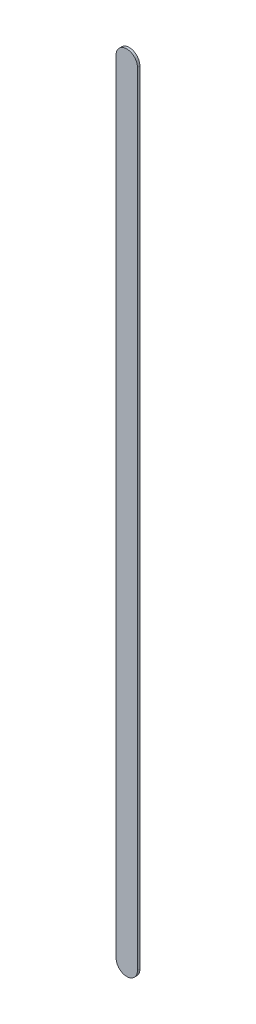
ISO-10303-21;
HEADER;
FILE_DESCRIPTION(('STEP AP214'),'2;1');
FILE_NAME('part.step','',(''),(''),'','','');
FILE_SCHEMA(('AUTOMOTIVE_DESIGN { 1 0 10303 214 1 1 1 1 }'));
ENDSEC;
DATA;
#1=APPLICATION_CONTEXT('core data for automotive mechanical design processes');
#2=APPLICATION_PROTOCOL_DEFINITION('international standard','automotive_design',2000,#1);
#3=PRODUCT_CONTEXT('',#1,'mechanical');
#4=PRODUCT('Part','Part','',(#3));
#5=PRODUCT_RELATED_PRODUCT_CATEGORY('part','',(#4));
#6=PRODUCT_DEFINITION_FORMATION('','',#4);
#7=PRODUCT_DEFINITION_CONTEXT('part definition',#1,'design');
#8=PRODUCT_DEFINITION('design','',#6,#7);
#9=PRODUCT_DEFINITION_SHAPE('','',#8);
#10=(LENGTH_UNIT() NAMED_UNIT(*) SI_UNIT(.MILLI.,.METRE.));
#11=(NAMED_UNIT(*) PLANE_ANGLE_UNIT() SI_UNIT($,.RADIAN.));
#12=(NAMED_UNIT(*) SI_UNIT($,.STERADIAN.) SOLID_ANGLE_UNIT());
#13=UNCERTAINTY_MEASURE_WITH_UNIT(LENGTH_MEASURE(1.E-05),#10,'distance_accuracy_value','');
#14=(GEOMETRIC_REPRESENTATION_CONTEXT(3) GLOBAL_UNCERTAINTY_ASSIGNED_CONTEXT((#13)) GLOBAL_UNIT_ASSIGNED_CONTEXT((#10,
#11,#12)) REPRESENTATION_CONTEXT('',''));
#15=CARTESIAN_POINT('',(0.,0.,0.));
#16=DIRECTION('',(0.,0.,1.));
#17=DIRECTION('',(1.,0.,0.));
#18=AXIS2_PLACEMENT_3D('',#15,#16,#17);
#19=CARTESIAN_POINT('',(136.04,-111.04,0.));
#20=DIRECTION('',(0.,0.,1.));
#21=DIRECTION('',(1.,0.,0.));
#22=AXIS2_PLACEMENT_3D('',#19,#20,#21);
#23=PLANE('',#22);
#24=DIRECTION('',(0.,-1.,0.));
#25=VECTOR('',#24,1.);
#26=CARTESIAN_POINT('',(136.04,-111.04,0.));
#27=LINE('',#26,#25);
#28=CARTESIAN_POINT('',(136.04,-111.04,0.));
#29=VERTEX_POINT('',#28);
#30=CARTESIAN_POINT('',(136.04,-122.03,0.));
#31=VERTEX_POINT('',#30);
#32=EDGE_CURVE('E91',#29,#31,#27,.T.);
#33=ORIENTED_EDGE('',*,*,#32,.T.);
#34=CARTESIAN_POINT('',(136.19,-122.03,0.));
#35=DIRECTION('',(0.,0.,1.));
#36=DIRECTION('',(-1.,0.,0.));
#37=AXIS2_PLACEMENT_3D('',#34,#35,#36);
#38=CIRCLE('',#37,0.15);
#39=CARTESIAN_POINT('',(136.34,-122.03,0.));
#40=VERTEX_POINT('',#39);
#41=EDGE_CURVE('E86',#31,#40,#38,.T.);
#42=ORIENTED_EDGE('',*,*,#41,.T.);
#43=DIRECTION('',(0.,1.,0.));
#44=VECTOR('',#43,1.);
#45=CARTESIAN_POINT('',(136.34,-122.03,0.));
#46=LINE('',#45,#44);
#47=CARTESIAN_POINT('',(136.34,-111.04,0.));
#48=VERTEX_POINT('',#47);
#49=EDGE_CURVE('E110',#40,#48,#46,.T.);
#50=ORIENTED_EDGE('',*,*,#49,.T.);
#51=CARTESIAN_POINT('',(136.19,-111.04,0.));
#52=DIRECTION('',(0.,0.,1.));
#53=DIRECTION('',(1.,0.,0.));
#54=AXIS2_PLACEMENT_3D('',#51,#52,#53);
#55=CIRCLE('',#54,0.15);
#56=EDGE_CURVE('E11',#48,#29,#55,.T.);
#57=ORIENTED_EDGE('',*,*,#56,.T.);
#58=EDGE_LOOP('',(#33,#42,#50,#57));
#59=FACE_BOUND('',#58,.T.);
#60=ADVANCED_FACE('F17',(#59),#23,.T.);
#61=CARTESIAN_POINT('',(136.04,-111.04,-0.035));
#62=DIRECTION('',(0.,0.,1.));
#63=DIRECTION('',(1.,0.,0.));
#64=AXIS2_PLACEMENT_3D('',#61,#62,#63);
#65=PLANE('',#64);
#66=CARTESIAN_POINT('',(136.19,-111.04,-0.035));
#67=DIRECTION('',(0.,0.,1.));
#68=DIRECTION('',(1.,0.,0.));
#69=AXIS2_PLACEMENT_3D('',#66,#67,#68);
#70=CIRCLE('',#69,0.15);
#71=CARTESIAN_POINT('',(136.34,-111.04,-0.035));
#72=VERTEX_POINT('',#71);
#73=CARTESIAN_POINT('',(136.04,-111.04,-0.035));
#74=VERTEX_POINT('',#73);
#75=EDGE_CURVE('E21',#72,#74,#70,.T.);
#76=ORIENTED_EDGE('',*,*,#75,.F.);
#77=DIRECTION('',(0.,1.,0.));
#78=VECTOR('',#77,1.);
#79=CARTESIAN_POINT('',(136.34,-122.03,-0.035));
#80=LINE('',#79,#78);
#81=CARTESIAN_POINT('',(136.34,-122.03,-0.035));
#82=VERTEX_POINT('',#81);
#83=EDGE_CURVE('E74',#82,#72,#80,.T.);
#84=ORIENTED_EDGE('',*,*,#83,.F.);
#85=CARTESIAN_POINT('',(136.19,-122.03,-0.035));
#86=DIRECTION('',(0.,0.,1.));
#87=DIRECTION('',(-1.,0.,0.));
#88=AXIS2_PLACEMENT_3D('',#85,#86,#87);
#89=CIRCLE('',#88,0.15);
#90=CARTESIAN_POINT('',(136.04,-122.03,-0.035));
#91=VERTEX_POINT('',#90);
#92=EDGE_CURVE('E69',#91,#82,#89,.T.);
#93=ORIENTED_EDGE('',*,*,#92,.F.);
#94=DIRECTION('',(0.,-1.,0.));
#95=VECTOR('',#94,1.);
#96=CARTESIAN_POINT('',(136.04,-111.04,-0.035));
#97=LINE('',#96,#95);
#98=EDGE_CURVE('E72',#74,#91,#97,.T.);
#99=ORIENTED_EDGE('',*,*,#98,.F.);
#100=EDGE_LOOP('',(#76,#84,#93,#99));
#101=FACE_BOUND('',#100,.T.);
#102=ADVANCED_FACE('F19',(#101),#65,.F.);
#103=CARTESIAN_POINT('',(136.19,-111.04,-0.035));
#104=DIRECTION('',(0.,0.,-1.));
#105=DIRECTION('',(1.,0.,0.));
#106=AXIS2_PLACEMENT_3D('',#103,#104,#105);
#107=CYLINDRICAL_SURFACE('',#106,0.15);
#108=ORIENTED_EDGE('',*,*,#75,.T.);
#109=DIRECTION('',(0.,0.,1.));
#110=VECTOR('',#109,1.);
#111=CARTESIAN_POINT('',(136.04,-111.04,-0.035));
#112=LINE('',#111,#110);
#113=EDGE_CURVE('E80',#74,#29,#112,.T.);
#114=ORIENTED_EDGE('',*,*,#113,.T.);
#115=ORIENTED_EDGE('',*,*,#56,.F.);
#116=DIRECTION('',(0.,0.,1.));
#117=VECTOR('',#116,1.);
#118=CARTESIAN_POINT('',(136.34,-111.04,-0.035));
#119=LINE('',#118,#117);
#120=EDGE_CURVE('E103',#72,#48,#119,.T.);
#121=ORIENTED_EDGE('',*,*,#120,.F.);
#122=EDGE_LOOP('',(#108,#114,#115,#121));
#123=FACE_BOUND('',#122,.T.);
#124=ADVANCED_FACE('F120',(#123),#107,.T.);
#125=CARTESIAN_POINT('',(136.34,-122.03,-0.035));
#126=DIRECTION('',(-1.,0.,0.));
#127=DIRECTION('',(0.,0.,1.));
#128=AXIS2_PLACEMENT_3D('',#125,#126,#127);
#129=PLANE('',#128);
#130=ORIENTED_EDGE('',*,*,#83,.T.);
#131=ORIENTED_EDGE('',*,*,#120,.T.);
#132=ORIENTED_EDGE('',*,*,#49,.F.);
#133=DIRECTION('',(0.,0.,1.));
#134=VECTOR('',#133,1.);
#135=CARTESIAN_POINT('',(136.34,-122.03,-0.035));
#136=LINE('',#135,#134);
#137=EDGE_CURVE('E79',#82,#40,#136,.T.);
#138=ORIENTED_EDGE('',*,*,#137,.F.);
#139=EDGE_LOOP('',(#130,#131,#132,#138));
#140=FACE_BOUND('',#139,.T.);
#141=ADVANCED_FACE('F119',(#140),#129,.F.);
#142=CARTESIAN_POINT('',(136.19,-122.03,-0.035));
#143=DIRECTION('',(0.,0.,-1.));
#144=DIRECTION('',(-1.,0.,0.));
#145=AXIS2_PLACEMENT_3D('',#142,#143,#144);
#146=CYLINDRICAL_SURFACE('',#145,0.15);
#147=ORIENTED_EDGE('',*,*,#92,.T.);
#148=ORIENTED_EDGE('',*,*,#137,.T.);
#149=ORIENTED_EDGE('',*,*,#41,.F.);
#150=DIRECTION('',(0.,0.,1.));
#151=VECTOR('',#150,1.);
#152=CARTESIAN_POINT('',(136.04,-122.03,-0.035));
#153=LINE('',#152,#151);
#154=EDGE_CURVE('E83',#91,#31,#153,.T.);
#155=ORIENTED_EDGE('',*,*,#154,.F.);
#156=EDGE_LOOP('',(#147,#148,#149,#155));
#157=FACE_BOUND('',#156,.T.);
#158=ADVANCED_FACE('F84',(#157),#146,.T.);
#159=CARTESIAN_POINT('',(136.04,-111.04,-0.035));
#160=DIRECTION('',(1.,0.,0.));
#161=DIRECTION('',(0.,1.,0.));
#162=AXIS2_PLACEMENT_3D('',#159,#160,#161);
#163=PLANE('',#162);
#164=ORIENTED_EDGE('',*,*,#98,.T.);
#165=ORIENTED_EDGE('',*,*,#154,.T.);
#166=ORIENTED_EDGE('',*,*,#32,.F.);
#167=ORIENTED_EDGE('',*,*,#113,.F.);
#168=EDGE_LOOP('',(#164,#165,#166,#167));
#169=FACE_BOUND('',#168,.T.);
#170=ADVANCED_FACE('F94',(#169),#163,.F.);
#171=CLOSED_SHELL('',(#60,#102,#124,#141,#158,#170));
#172=MANIFOLD_SOLID_BREP('B1',#171);
#173=ADVANCED_BREP_SHAPE_REPRESENTATION('',(#18,#172),#14);
#174=SHAPE_DEFINITION_REPRESENTATION(#9,#173);
ENDSEC;
END-ISO-10303-21;
